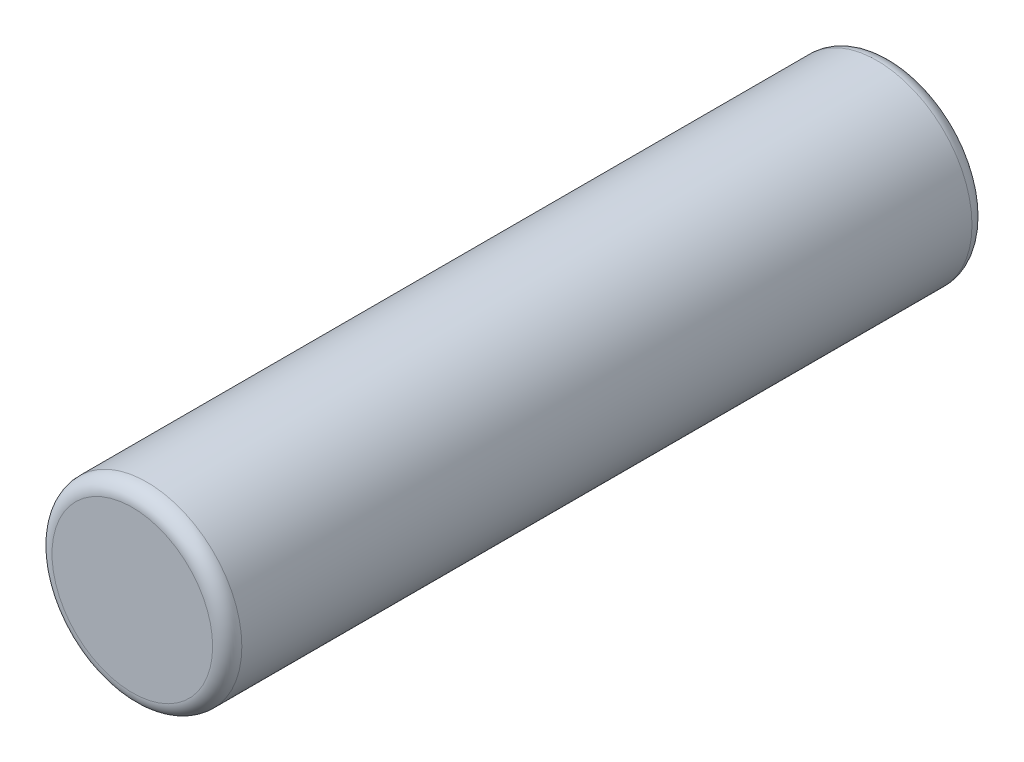
ISO-10303-21;
HEADER;
FILE_DESCRIPTION(('STEP AP214'),'2;1');
FILE_NAME('part.step','',(''),(''),'','','');
FILE_SCHEMA(('AUTOMOTIVE_DESIGN { 1 0 10303 214 1 1 1 1 }'));
ENDSEC;
DATA;
#1=APPLICATION_CONTEXT('core data for automotive mechanical design processes');
#2=APPLICATION_PROTOCOL_DEFINITION('international standard','automotive_design',2000,#1);
#3=PRODUCT_CONTEXT('',#1,'mechanical');
#4=PRODUCT('Part','Part','',(#3));
#5=PRODUCT_RELATED_PRODUCT_CATEGORY('part','',(#4));
#6=PRODUCT_DEFINITION_FORMATION('','',#4);
#7=PRODUCT_DEFINITION_CONTEXT('part definition',#1,'design');
#8=PRODUCT_DEFINITION('design','',#6,#7);
#9=PRODUCT_DEFINITION_SHAPE('','',#8);
#10=(LENGTH_UNIT() NAMED_UNIT(*) SI_UNIT(.MILLI.,.METRE.));
#11=(NAMED_UNIT(*) PLANE_ANGLE_UNIT() SI_UNIT($,.RADIAN.));
#12=(NAMED_UNIT(*) SI_UNIT($,.STERADIAN.) SOLID_ANGLE_UNIT());
#13=UNCERTAINTY_MEASURE_WITH_UNIT(LENGTH_MEASURE(1.E-05),#10,'distance_accuracy_value','');
#14=(GEOMETRIC_REPRESENTATION_CONTEXT(3) GLOBAL_UNCERTAINTY_ASSIGNED_CONTEXT((#13)) GLOBAL_UNIT_ASSIGNED_CONTEXT((#10,
#11,#12)) REPRESENTATION_CONTEXT('',''));
#15=CARTESIAN_POINT('',(0.,0.,0.));
#16=DIRECTION('',(0.,0.,1.));
#17=DIRECTION('',(1.,0.,0.));
#18=AXIS2_PLACEMENT_3D('',#15,#16,#17);
#19=CARTESIAN_POINT('',(0.,0.,6.5));
#20=DIRECTION('',(0.,0.,-1.));
#21=DIRECTION('',(-1.,0.,0.));
#22=AXIS2_PLACEMENT_3D('',#19,#20,#21);
#23=CYLINDRICAL_SURFACE('',#22,1.625);
#24=CARTESIAN_POINT('',(0.,0.,-6.25));
#25=DIRECTION('',(0.,0.,1.));
#26=DIRECTION('',(1.,0.,0.));
#27=AXIS2_PLACEMENT_3D('',#24,#25,#26);
#28=CIRCLE('',#27,1.625);
#29=CARTESIAN_POINT('',(-1.625,0.,-6.25));
#30=VERTEX_POINT('',#29);
#31=EDGE_CURVE('E41',#30,#30,#28,.T.);
#32=CARTESIAN_POINT('',(0.,0.,6.25));
#33=DIRECTION('',(0.,0.,1.));
#34=DIRECTION('',(1.,0.,0.));
#35=AXIS2_PLACEMENT_3D('',#32,#33,#34);
#36=CIRCLE('',#35,1.625);
#37=CARTESIAN_POINT('',(-1.625,0.,6.25));
#38=VERTEX_POINT('',#37);
#39=EDGE_CURVE('E45',#38,#38,#36,.F.);
#40=CARTESIAN_POINT('',(-1.625,0.,-6.25));
#41=CARTESIAN_POINT('',(-1.625,0.,-6.11979166666667));
#42=CARTESIAN_POINT('',(-1.625,0.,-5.98958333333334));
#43=CARTESIAN_POINT('',(-1.625,0.,-5.72916666666667));
#44=CARTESIAN_POINT('',(-1.625,0.,-5.59895833333334));
#45=CARTESIAN_POINT('',(-1.625,0.,-5.33854166666667));
#46=CARTESIAN_POINT('',(-1.625,0.,-5.20833333333334));
#47=CARTESIAN_POINT('',(-1.625,0.,-4.94791666666667));
#48=CARTESIAN_POINT('',(-1.625,0.,-4.81770833333334));
#49=CARTESIAN_POINT('',(-1.625,0.,-4.55729166666667));
#50=CARTESIAN_POINT('',(-1.625,0.,-4.42708333333334));
#51=CARTESIAN_POINT('',(-1.625,0.,-4.16666666666667));
#52=CARTESIAN_POINT('',(-1.625,0.,-4.03645833333334));
#53=CARTESIAN_POINT('',(-1.625,0.,-3.77604166666667));
#54=CARTESIAN_POINT('',(-1.625,0.,-3.64583333333334));
#55=CARTESIAN_POINT('',(-1.625,0.,-3.38541666666667));
#56=CARTESIAN_POINT('',(-1.625,0.,-3.25520833333334));
#57=CARTESIAN_POINT('',(-1.625,0.,-2.99479166666667));
#58=CARTESIAN_POINT('',(-1.625,0.,-2.86458333333333));
#59=CARTESIAN_POINT('',(-1.625,0.,-2.60416666666667));
#60=CARTESIAN_POINT('',(-1.625,0.,-2.47395833333333));
#61=CARTESIAN_POINT('',(-1.625,0.,-2.21354166666667));
#62=CARTESIAN_POINT('',(-1.625,0.,-2.08333333333333));
#63=CARTESIAN_POINT('',(-1.625,0.,-1.82291666666667));
#64=CARTESIAN_POINT('',(-1.625,0.,-1.69270833333334));
#65=CARTESIAN_POINT('',(-1.625,0.,-1.43229166666667));
#66=CARTESIAN_POINT('',(-1.625,0.,-1.30208333333334));
#67=CARTESIAN_POINT('',(-1.625,0.,-1.04166666666667));
#68=CARTESIAN_POINT('',(-1.625,0.,-0.911458333333335));
#69=CARTESIAN_POINT('',(-1.625,0.,-0.651041666666669));
#70=CARTESIAN_POINT('',(-1.625,0.,-0.520833333333335));
#71=CARTESIAN_POINT('',(-1.625,0.,-0.260416666666669));
#72=CARTESIAN_POINT('',(-1.625,0.,-0.130208333333335));
#73=CARTESIAN_POINT('',(-1.625,0.,0.130208333333332));
#74=CARTESIAN_POINT('',(-1.625,0.,0.260416666666665));
#75=CARTESIAN_POINT('',(-1.625,0.,0.520833333333332));
#76=CARTESIAN_POINT('',(-1.625,0.,0.651041666666666));
#77=CARTESIAN_POINT('',(-1.625,0.,0.911458333333332));
#78=CARTESIAN_POINT('',(-1.625,0.,1.04166666666667));
#79=CARTESIAN_POINT('',(-1.625,0.,1.30208333333333));
#80=CARTESIAN_POINT('',(-1.625,0.,1.43229166666667));
#81=CARTESIAN_POINT('',(-1.625,0.,1.69270833333333));
#82=CARTESIAN_POINT('',(-1.625,0.,1.82291666666667));
#83=CARTESIAN_POINT('',(-1.625,0.,2.08333333333333));
#84=CARTESIAN_POINT('',(-1.625,0.,2.21354166666667));
#85=CARTESIAN_POINT('',(-1.625,0.,2.47395833333333));
#86=CARTESIAN_POINT('',(-1.625,0.,2.60416666666667));
#87=CARTESIAN_POINT('',(-1.625,0.,2.86458333333333));
#88=CARTESIAN_POINT('',(-1.625,0.,2.99479166666667));
#89=CARTESIAN_POINT('',(-1.625,0.,3.25520833333333));
#90=CARTESIAN_POINT('',(-1.625,0.,3.38541666666667));
#91=CARTESIAN_POINT('',(-1.625,0.,3.64583333333333));
#92=CARTESIAN_POINT('',(-1.625,0.,3.77604166666667));
#93=CARTESIAN_POINT('',(-1.625,0.,4.03645833333333));
#94=CARTESIAN_POINT('',(-1.625,0.,4.16666666666667));
#95=CARTESIAN_POINT('',(-1.625,0.,4.42708333333333));
#96=CARTESIAN_POINT('',(-1.625,0.,4.55729166666667));
#97=CARTESIAN_POINT('',(-1.625,0.,4.81770833333333));
#98=CARTESIAN_POINT('',(-1.625,0.,4.94791666666666));
#99=CARTESIAN_POINT('',(-1.625,0.,5.20833333333333));
#100=CARTESIAN_POINT('',(-1.625,0.,5.33854166666667));
#101=CARTESIAN_POINT('',(-1.625,0.,5.59895833333333));
#102=CARTESIAN_POINT('',(-1.625,0.,5.72916666666667));
#103=CARTESIAN_POINT('',(-1.625,0.,5.98958333333333));
#104=CARTESIAN_POINT('',(-1.625,0.,6.11979166666667));
#105=CARTESIAN_POINT('',(-1.625,0.,6.25));
#106=B_SPLINE_CURVE_WITH_KNOTS('',3,(#40,#41,#42,#43,#44,#45,#46,#47,#48,#49,#50,#51,#52,#53,
#54,#55,#56,#57,#58,#59,#60,#61,#62,#63,#64,#65,#66,#67,#68,#69,#70,#71,#72,#73,#74,#75,#76,#77,
#78,#79,#80,#81,#82,#83,#84,#85,#86,#87,#88,#89,#90,#91,#92,#93,#94,#95,#96,#97,#98,#99,#100,
#101,#102,#103,#104,#105),.UNSPECIFIED.,.F.,.F.,(4,2,2,2,2,2,2,2,2,2,2,2,2,2,2,2,2,2,2,2,2,2,2,
2,2,2,2,2,2,2,2,2,4),(0.,0.390625,0.781250000000001,1.171875,1.5625,1.953125,2.34375,2.734375,
3.125,3.515625,3.90625,4.296875,4.6875,5.078125,5.46875,5.859375,6.25,6.640625,7.03125,7.421875,
7.8125,8.203125,8.59375,8.984375,9.375,9.765625,10.15625,10.546875,10.9375,11.328125,11.71875,
12.109375,12.5),.UNSPECIFIED.);
#107=EDGE_CURVE('BSEAM30',#30,#38,#106,.T.);
#108=ORIENTED_EDGE('',*,*,#31,.T.);
#109=ORIENTED_EDGE('',*,*,#39,.T.);
#110=ORIENTED_EDGE('',*,*,#107,.T.);
#111=ORIENTED_EDGE('',*,*,#107,.F.);
#112=EDGE_LOOP('',(#108,#110,#109,#111));
#113=FACE_BOUND('',#112,.T.);
#114=ADVANCED_FACE('F30',(#113),#23,.T.);
#115=CARTESIAN_POINT('',(0.,0.,6.5));
#116=DIRECTION('',(0.,0.,1.));
#117=DIRECTION('',(1.,0.,0.));
#118=AXIS2_PLACEMENT_3D('',#115,#116,#117);
#119=PLANE('',#118);
#120=CARTESIAN_POINT('',(0.,0.,6.5));
#121=DIRECTION('',(0.,0.,1.));
#122=DIRECTION('',(1.,0.,0.));
#123=AXIS2_PLACEMENT_3D('',#120,#121,#122);
#124=CIRCLE('',#123,1.375);
#125=CARTESIAN_POINT('',(1.375,0.,6.5));
#126=VERTEX_POINT('',#125);
#127=EDGE_CURVE('E10',#126,#126,#124,.T.);
#128=ORIENTED_EDGE('',*,*,#127,.T.);
#129=EDGE_LOOP('',(#128));
#130=FACE_BOUND('',#129,.T.);
#131=ADVANCED_FACE('F61',(#130),#119,.T.);
#132=CARTESIAN_POINT('',(0.,0.,-6.5));
#133=DIRECTION('',(0.,0.,1.));
#134=DIRECTION('',(1.,0.,0.));
#135=AXIS2_PLACEMENT_3D('',#132,#133,#134);
#136=PLANE('',#135);
#137=CARTESIAN_POINT('',(0.,0.,-6.5));
#138=DIRECTION('',(0.,0.,1.));
#139=DIRECTION('',(1.,0.,0.));
#140=AXIS2_PLACEMENT_3D('',#137,#138,#139);
#141=CIRCLE('',#140,1.375);
#142=CARTESIAN_POINT('',(1.375,0.,-6.5));
#143=VERTEX_POINT('',#142);
#144=EDGE_CURVE('E37',#143,#143,#141,.F.);
#145=ORIENTED_EDGE('',*,*,#144,.T.);
#146=EDGE_LOOP('',(#145));
#147=FACE_BOUND('',#146,.T.);
#148=ADVANCED_FACE('F58',(#147),#136,.F.);
#149=CARTESIAN_POINT('',(0.,0.,-6.25));
#150=DIRECTION('',(0.,0.,1.));
#151=DIRECTION('',(1.,0.,0.));
#152=AXIS2_PLACEMENT_3D('',#149,#150,#151);
#153=TOROIDAL_SURFACE('',#152,1.375,0.25);
#154=ORIENTED_EDGE('',*,*,#144,.F.);
#155=EDGE_LOOP('',(#154));
#156=FACE_BOUND('',#155,.T.);
#157=ORIENTED_EDGE('',*,*,#31,.F.);
#158=EDGE_LOOP('',(#157));
#159=FACE_BOUND('',#158,.T.);
#160=ADVANCED_FACE('F54',(#156,#159),#153,.T.);
#161=CARTESIAN_POINT('',(0.,0.,6.25));
#162=DIRECTION('',(0.,0.,1.));
#163=DIRECTION('',(1.,0.,0.));
#164=AXIS2_PLACEMENT_3D('',#161,#162,#163);
#165=TOROIDAL_SURFACE('',#164,1.375,0.25);
#166=ORIENTED_EDGE('',*,*,#39,.F.);
#167=EDGE_LOOP('',(#166));
#168=FACE_BOUND('',#167,.T.);
#169=ORIENTED_EDGE('',*,*,#127,.F.);
#170=EDGE_LOOP('',(#169));
#171=FACE_BOUND('',#170,.T.);
#172=ADVANCED_FACE('F32',(#168,#171),#165,.T.);
#173=CLOSED_SHELL('',(#114,#131,#148,#160,#172));
#174=MANIFOLD_SOLID_BREP('B2',#173);
#175=ADVANCED_BREP_SHAPE_REPRESENTATION('',(#18,#174),#14);
#176=SHAPE_DEFINITION_REPRESENTATION(#9,#175);
ENDSEC;
END-ISO-10303-21;
